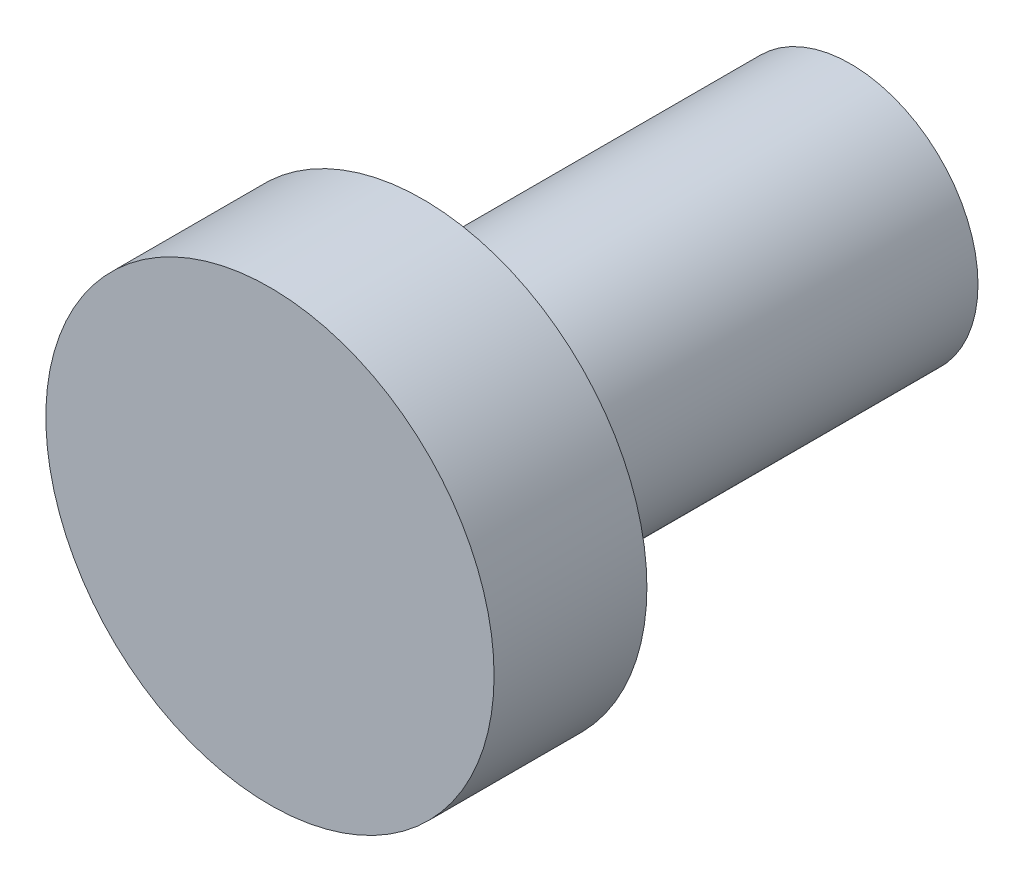
ISO-10303-21;
HEADER;
FILE_DESCRIPTION(('STEP AP214'),'2;1');
FILE_NAME('part.step','',(''),(''),'','','');
FILE_SCHEMA(('AUTOMOTIVE_DESIGN { 1 0 10303 214 1 1 1 1 }'));
ENDSEC;
DATA;
#1=APPLICATION_CONTEXT('core data for automotive mechanical design processes');
#2=APPLICATION_PROTOCOL_DEFINITION('international standard','automotive_design',2000,#1);
#3=PRODUCT_CONTEXT('',#1,'mechanical');
#4=PRODUCT('Part','Part','',(#3));
#5=PRODUCT_RELATED_PRODUCT_CATEGORY('part','',(#4));
#6=PRODUCT_DEFINITION_FORMATION('','',#4);
#7=PRODUCT_DEFINITION_CONTEXT('part definition',#1,'design');
#8=PRODUCT_DEFINITION('design','',#6,#7);
#9=PRODUCT_DEFINITION_SHAPE('','',#8);
#10=(LENGTH_UNIT() NAMED_UNIT(*) SI_UNIT(.MILLI.,.METRE.));
#11=(NAMED_UNIT(*) PLANE_ANGLE_UNIT() SI_UNIT($,.RADIAN.));
#12=(NAMED_UNIT(*) SI_UNIT($,.STERADIAN.) SOLID_ANGLE_UNIT());
#13=UNCERTAINTY_MEASURE_WITH_UNIT(LENGTH_MEASURE(1.E-05),#10,'distance_accuracy_value','');
#14=(GEOMETRIC_REPRESENTATION_CONTEXT(3) GLOBAL_UNCERTAINTY_ASSIGNED_CONTEXT((#13)) GLOBAL_UNIT_ASSIGNED_CONTEXT((#10,
#11,#12)) REPRESENTATION_CONTEXT('',''));
#15=CARTESIAN_POINT('',(0.,0.,0.));
#16=DIRECTION('',(0.,0.,1.));
#17=DIRECTION('',(1.,0.,0.));
#18=AXIS2_PLACEMENT_3D('',#15,#16,#17);
#19=CARTESIAN_POINT('',(0.,0.,4.2));
#20=DIRECTION('',(0.,0.,-1.));
#21=DIRECTION('',(-1.,0.,0.));
#22=AXIS2_PLACEMENT_3D('',#19,#20,#21);
#23=CYLINDRICAL_SURFACE('',#22,1.25);
#24=CARTESIAN_POINT('',(0.,0.,4.2));
#25=DIRECTION('',(0.,0.,1.));
#26=DIRECTION('',(1.,0.,0.));
#27=AXIS2_PLACEMENT_3D('',#24,#25,#26);
#28=CIRCLE('',#27,1.25);
#29=CARTESIAN_POINT('',(1.25,0.,4.2));
#30=VERTEX_POINT('',#29);
#31=EDGE_CURVE('E10',#30,#30,#28,.T.);
#32=ORIENTED_EDGE('',*,*,#31,.F.);
#33=EDGE_LOOP('',(#32));
#34=FACE_BOUND('',#33,.T.);
#35=CARTESIAN_POINT('',(0.,0.,0.));
#36=DIRECTION('',(0.,0.,1.));
#37=DIRECTION('',(1.,0.,0.));
#38=AXIS2_PLACEMENT_3D('',#35,#36,#37);
#39=CIRCLE('',#38,1.25);
#40=CARTESIAN_POINT('',(1.25,0.,0.));
#41=VERTEX_POINT('',#40);
#42=EDGE_CURVE('E42',#41,#41,#39,.T.);
#43=ORIENTED_EDGE('',*,*,#42,.T.);
#44=EDGE_LOOP('',(#43));
#45=FACE_BOUND('',#44,.T.);
#46=ADVANCED_FACE('F39',(#34,#45),#23,.T.);
#47=CARTESIAN_POINT('',(0.,0.,0.));
#48=DIRECTION('',(0.,0.,1.));
#49=DIRECTION('',(1.,0.,0.));
#50=AXIS2_PLACEMENT_3D('',#47,#48,#49);
#51=PLANE('',#50);
#52=ORIENTED_EDGE('',*,*,#42,.F.);
#53=EDGE_LOOP('',(#52));
#54=FACE_BOUND('',#53,.T.);
#55=ADVANCED_FACE('F62',(#54),#51,.F.);
#56=CARTESIAN_POINT('',(0.,0.,5.7));
#57=DIRECTION('',(0.,0.,-1.));
#58=DIRECTION('',(-1.,0.,0.));
#59=AXIS2_PLACEMENT_3D('',#56,#57,#58);
#60=CYLINDRICAL_SURFACE('',#59,2.2);
#61=CARTESIAN_POINT('',(0.,0.,5.7));
#62=DIRECTION('',(0.,0.,1.));
#63=DIRECTION('',(1.,0.,0.));
#64=AXIS2_PLACEMENT_3D('',#61,#62,#63);
#65=CIRCLE('',#64,2.2);
#66=CARTESIAN_POINT('',(2.2,0.,5.7));
#67=VERTEX_POINT('',#66);
#68=EDGE_CURVE('E49',#67,#67,#65,.T.);
#69=ORIENTED_EDGE('',*,*,#68,.F.);
#70=EDGE_LOOP('',(#69));
#71=FACE_BOUND('',#70,.T.);
#72=CARTESIAN_POINT('',(0.,0.,4.2));
#73=DIRECTION('',(0.,0.,1.));
#74=DIRECTION('',(1.,0.,0.));
#75=AXIS2_PLACEMENT_3D('',#72,#73,#74);
#76=CIRCLE('',#75,2.2);
#77=CARTESIAN_POINT('',(2.2,0.,4.2));
#78=VERTEX_POINT('',#77);
#79=EDGE_CURVE('E51',#78,#78,#76,.T.);
#80=ORIENTED_EDGE('',*,*,#79,.T.);
#81=EDGE_LOOP('',(#80));
#82=FACE_BOUND('',#81,.T.);
#83=ADVANCED_FACE('F59',(#71,#82),#60,.T.);
#84=CARTESIAN_POINT('',(0.,0.,5.7));
#85=DIRECTION('',(0.,0.,1.));
#86=DIRECTION('',(1.,0.,0.));
#87=AXIS2_PLACEMENT_3D('',#84,#85,#86);
#88=PLANE('',#87);
#89=ORIENTED_EDGE('',*,*,#68,.T.);
#90=EDGE_LOOP('',(#89));
#91=FACE_BOUND('',#90,.T.);
#92=ADVANCED_FACE('F57',(#91),#88,.T.);
#93=CARTESIAN_POINT('',(0.,0.,4.2));
#94=DIRECTION('',(0.,0.,1.));
#95=DIRECTION('',(1.,0.,0.));
#96=AXIS2_PLACEMENT_3D('',#93,#94,#95);
#97=PLANE('',#96);
#98=ORIENTED_EDGE('',*,*,#31,.T.);
#99=EDGE_LOOP('',(#98));
#100=FACE_BOUND('',#99,.T.);
#101=ORIENTED_EDGE('',*,*,#79,.F.);
#102=EDGE_LOOP('',(#101));
#103=FACE_BOUND('',#102,.T.);
#104=ADVANCED_FACE('F66',(#100,#103),#97,.F.);
#105=CLOSED_SHELL('',(#46,#55,#83,#92,#104));
#106=MANIFOLD_SOLID_BREP('B2',#105);
#107=ADVANCED_BREP_SHAPE_REPRESENTATION('',(#18,#106),#14);
#108=SHAPE_DEFINITION_REPRESENTATION(#9,#107);
ENDSEC;
END-ISO-10303-21;
